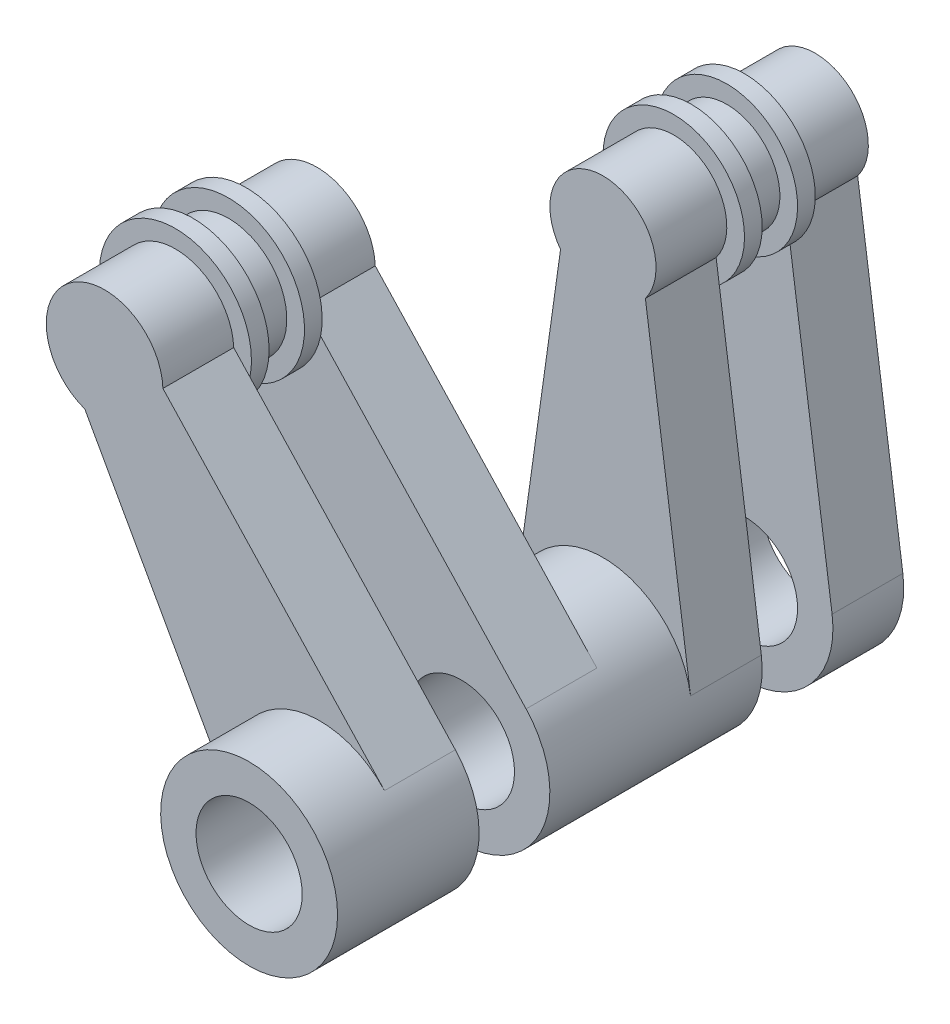
ISO-10303-21;
HEADER;
FILE_DESCRIPTION(('STEP AP214'),'2;1');
FILE_NAME('part.step','',(''),(''),'','','');
FILE_SCHEMA(('AUTOMOTIVE_DESIGN { 1 0 10303 214 1 1 1 1 }'));
ENDSEC;
DATA;
#1=APPLICATION_CONTEXT('core data for automotive mechanical design processes');
#2=APPLICATION_PROTOCOL_DEFINITION('international standard','automotive_design',2000,#1);
#3=PRODUCT_CONTEXT('',#1,'mechanical');
#4=PRODUCT('Part','Part','',(#3));
#5=PRODUCT_RELATED_PRODUCT_CATEGORY('part','',(#4));
#6=PRODUCT_DEFINITION_FORMATION('','',#4);
#7=PRODUCT_DEFINITION_CONTEXT('part definition',#1,'design');
#8=PRODUCT_DEFINITION('design','',#6,#7);
#9=PRODUCT_DEFINITION_SHAPE('','',#8);
#10=(LENGTH_UNIT() NAMED_UNIT(*) SI_UNIT(.MILLI.,.METRE.));
#11=(NAMED_UNIT(*) PLANE_ANGLE_UNIT() SI_UNIT($,.RADIAN.));
#12=(NAMED_UNIT(*) SI_UNIT($,.STERADIAN.) SOLID_ANGLE_UNIT());
#13=UNCERTAINTY_MEASURE_WITH_UNIT(LENGTH_MEASURE(1.E-05),#10,'distance_accuracy_value','');
#14=(GEOMETRIC_REPRESENTATION_CONTEXT(3) GLOBAL_UNCERTAINTY_ASSIGNED_CONTEXT((#13)) GLOBAL_UNIT_ASSIGNED_CONTEXT((#10,
#11,#12)) REPRESENTATION_CONTEXT('',''));
#15=CARTESIAN_POINT('',(0.,0.,0.));
#16=DIRECTION('',(0.,0.,1.));
#17=DIRECTION('',(1.,0.,0.));
#18=AXIS2_PLACEMENT_3D('',#15,#16,#17);
#19=CARTESIAN_POINT('',(0.,10.34,2.));
#20=DIRECTION('',(0.,0.,-1.));
#21=DIRECTION('',(-1.,0.,0.));
#22=AXIS2_PLACEMENT_3D('',#19,#20,#21);
#23=CYLINDRICAL_SURFACE('',#22,1.5);
#24=DIRECTION('',(0.,0.,1.));
#25=VECTOR('',#24,1.);
#26=CARTESIAN_POINT('',(1.19886698866081,9.4384912959381,4.));
#27=LINE('',#26,#25);
#28=CARTESIAN_POINT('',(1.19886698866081,9.4384912959381,4.));
#29=VERTEX_POINT('',#28);
#30=CARTESIAN_POINT('',(1.19886698866081,9.4384912959381,6.));
#31=VERTEX_POINT('',#30);
#32=EDGE_CURVE('E230',#29,#31,#27,.T.);
#33=ORIENTED_EDGE('',*,*,#32,.F.);
#34=CARTESIAN_POINT('',(0.,10.34,4.));
#35=DIRECTION('',(0.,0.,1.));
#36=DIRECTION('',(1.,0.,0.));
#37=AXIS2_PLACEMENT_3D('',#34,#35,#36);
#38=CIRCLE('',#37,1.5);
#39=CARTESIAN_POINT('',(-1.19877786302463,9.43837278483726,4.));
#40=VERTEX_POINT('',#39);
#41=EDGE_CURVE('E204',#29,#40,#38,.T.);
#42=ORIENTED_EDGE('',*,*,#41,.T.);
#43=DIRECTION('',(0.,0.,1.));
#44=VECTOR('',#43,1.);
#45=CARTESIAN_POINT('',(-1.19877786302463,9.43837278483726,4.));
#46=LINE('',#45,#44);
#47=CARTESIAN_POINT('',(-1.19877786302463,9.43837278483726,6.));
#48=VERTEX_POINT('',#47);
#49=EDGE_CURVE('E219',#40,#48,#46,.T.);
#50=ORIENTED_EDGE('',*,*,#49,.T.);
#51=CARTESIAN_POINT('',(0.,10.34,6.));
#52=DIRECTION('',(0.,0.,1.));
#53=DIRECTION('',(1.,0.,0.));
#54=AXIS2_PLACEMENT_3D('',#51,#52,#53);
#55=CIRCLE('',#54,1.5);
#56=EDGE_CURVE('E231',#31,#48,#55,.T.);
#57=ORIENTED_EDGE('',*,*,#56,.F.);
#58=EDGE_LOOP('',(#33,#42,#50,#57));
#59=FACE_BOUND('',#58,.T.);
#60=ADVANCED_FACE('F45',(#59),#23,.T.);
#61=CARTESIAN_POINT('',(-6.08359041985846,8.36095255359139,10.));
#62=DIRECTION('',(0.,0.,-1.));
#63=DIRECTION('',(-1.,0.,0.));
#64=AXIS2_PLACEMENT_3D('',#61,#62,#63);
#65=CYLINDRICAL_SURFACE('',#64,1.64862154811596);
#66=CARTESIAN_POINT('',(-6.08359041985846,8.36095255359139,11.5));
#67=DIRECTION('',(0.,0.,1.));
#68=DIRECTION('',(1.,0.,0.));
#69=AXIS2_PLACEMENT_3D('',#66,#67,#68);
#70=CIRCLE('',#69,1.64862154811596);
#71=CARTESIAN_POINT('',(-4.4349688717425,8.36095255359139,11.5));
#72=VERTEX_POINT('',#71);
#73=EDGE_CURVE('E301',#72,#72,#70,.T.);
#74=ORIENTED_EDGE('',*,*,#73,.F.);
#75=EDGE_LOOP('',(#74));
#76=FACE_BOUND('',#75,.T.);
#77=CARTESIAN_POINT('',(-6.08359041985846,8.36095255359139,10.5));
#78=DIRECTION('',(0.,0.,-1.));
#79=DIRECTION('',(-1.,0.,0.));
#80=AXIS2_PLACEMENT_3D('',#77,#78,#79);
#81=CIRCLE('',#80,1.64862154811596);
#82=CARTESIAN_POINT('',(-7.73221196797443,8.36095255359139,10.5));
#83=VERTEX_POINT('',#82);
#84=EDGE_CURVE('E311',#83,#83,#81,.T.);
#85=ORIENTED_EDGE('',*,*,#84,.F.);
#86=EDGE_LOOP('',(#85));
#87=FACE_BOUND('',#86,.T.);
#88=ADVANCED_FACE('F512',(#76,#87),#65,.T.);
#89=CARTESIAN_POINT('',(-6.08359041985846,8.36095255359139,12.));
#90=DIRECTION('',(0.,0.,1.));
#91=DIRECTION('',(1.,0.,0.));
#92=AXIS2_PLACEMENT_3D('',#89,#90,#91);
#93=PLANE('',#92);
#94=DIRECTION('',(0.485671715826206,-0.874141284030464,0.));
#95=VECTOR('',#94,1.);
#96=CARTESIAN_POINT('',(-6.64381956136073,6.81043769783415,12.));
#97=LINE('',#96,#95);
#98=CARTESIAN_POINT('',(-6.64381956136073,6.81043769783415,12.));
#99=VERTEX_POINT('',#98);
#100=CARTESIAN_POINT('',(-6.31867935565751,6.22523072027762,12.));
#101=VERTEX_POINT('',#100);
#102=EDGE_CURVE('E392',#99,#101,#97,.T.);
#103=ORIENTED_EDGE('',*,*,#102,.F.);
#104=CARTESIAN_POINT('',(-6.08359041985846,8.36095255359139,12.));
#105=DIRECTION('',(0.,0.,1.));
#106=DIRECTION('',(1.,0.,0.));
#107=AXIS2_PLACEMENT_3D('',#104,#105,#106);
#108=CIRCLE('',#107,1.64862154811596);
#109=CARTESIAN_POINT('',(-4.43592008775849,8.41694796081221,12.));
#110=VERTEX_POINT('',#109);
#111=EDGE_CURVE('E307',#110,#99,#108,.T.);
#112=ORIENTED_EDGE('',*,*,#111,.F.);
#113=DIRECTION('',(-0.682307542748021,0.731065261867337,0.));
#114=VECTOR('',#113,1.);
#115=CARTESIAN_POINT('',(-4.43592008775849,8.41694796081221,12.));
#116=LINE('',#115,#114);
#117=CARTESIAN_POINT('',(-3.97913908204446,7.92752536962494,12.));
#118=VERTEX_POINT('',#117);
#119=EDGE_CURVE('E401',#118,#110,#116,.T.);
#120=ORIENTED_EDGE('',*,*,#119,.F.);
#121=CARTESIAN_POINT('',(-6.08359041985846,8.36095255359139,12.));
#122=DIRECTION('',(0.,0.,1.));
#123=DIRECTION('',(1.,0.,0.));
#124=AXIS2_PLACEMENT_3D('',#121,#122,#123);
#125=CIRCLE('',#124,2.14862154811596);
#126=EDGE_CURVE('E376',#118,#101,#125,.T.);
#127=ORIENTED_EDGE('',*,*,#126,.T.);
#128=EDGE_LOOP('',(#103,#112,#120,#127));
#129=FACE_BOUND('',#128,.T.);
#130=ADVANCED_FACE('F519',(#129),#93,.T.);
#131=CARTESIAN_POINT('',(-6.08359041985846,8.36095255359139,11.5));
#132=DIRECTION('',(0.,0.,1.));
#133=DIRECTION('',(1.,0.,0.));
#134=AXIS2_PLACEMENT_3D('',#131,#132,#133);
#135=CYLINDRICAL_SURFACE('',#134,2.14862154811596);
#136=CARTESIAN_POINT('',(-6.08359041985846,8.36095255359139,11.5));
#137=DIRECTION('',(0.,0.,1.));
#138=DIRECTION('',(1.,0.,0.));
#139=AXIS2_PLACEMENT_3D('',#136,#137,#138);
#140=CIRCLE('',#139,2.14862154811596);
#141=CARTESIAN_POINT('',(-3.9349688717425,8.36095255359139,11.5));
#142=VERTEX_POINT('',#141);
#143=EDGE_CURVE('E377',#142,#142,#140,.T.);
#144=ORIENTED_EDGE('',*,*,#143,.T.);
#145=EDGE_LOOP('',(#144));
#146=FACE_BOUND('',#145,.T.);
#147=EDGE_CURVE('E381',#101,#118,#125,.T.);
#148=ORIENTED_EDGE('',*,*,#147,.F.);
#149=ORIENTED_EDGE('',*,*,#126,.F.);
#150=EDGE_LOOP('',(#148,#149));
#151=FACE_BOUND('',#150,.T.);
#152=ADVANCED_FACE('F562',(#146,#151),#135,.T.);
#153=CARTESIAN_POINT('',(-6.08359041985846,8.36095255359139,11.5));
#154=DIRECTION('',(0.,0.,1.));
#155=DIRECTION('',(1.,0.,0.));
#156=AXIS2_PLACEMENT_3D('',#153,#154,#155);
#157=PLANE('',#156);
#158=ORIENTED_EDGE('',*,*,#73,.T.);
#159=EDGE_LOOP('',(#158));
#160=FACE_BOUND('',#159,.T.);
#161=ORIENTED_EDGE('',*,*,#143,.F.);
#162=EDGE_LOOP('',(#161));
#163=FACE_BOUND('',#162,.T.);
#164=ADVANCED_FACE('F558',(#160,#163),#157,.F.);
#165=CARTESIAN_POINT('',(0.,10.34,16.));
#166=DIRECTION('',(0.,0.,1.));
#167=DIRECTION('',(1.,0.,0.));
#168=AXIS2_PLACEMENT_3D('',#165,#166,#167);
#169=PLANE('',#168);
#170=CARTESIAN_POINT('',(0.,0.,16.));
#171=DIRECTION('',(0.,0.,1.));
#172=DIRECTION('',(1.,0.,0.));
#173=AXIS2_PLACEMENT_3D('',#170,#171,#172);
#174=CIRCLE('',#173,1.5);
#175=CARTESIAN_POINT('',(1.5,0.,16.));
#176=VERTEX_POINT('',#175);
#177=EDGE_CURVE('E302',#176,#176,#174,.T.);
#178=ORIENTED_EDGE('',*,*,#177,.F.);
#179=EDGE_LOOP('',(#178));
#180=FACE_BOUND('',#179,.T.);
#181=CARTESIAN_POINT('',(0.,0.,16.));
#182=DIRECTION('',(0.,0.,1.));
#183=DIRECTION('',(1.,0.,0.));
#184=AXIS2_PLACEMENT_3D('',#181,#182,#183);
#185=CIRCLE('',#184,2.5);
#186=CARTESIAN_POINT('',(2.5,0.,16.));
#187=VERTEX_POINT('',#186);
#188=EDGE_CURVE('E430',#187,#187,#185,.T.);
#189=ORIENTED_EDGE('',*,*,#188,.T.);
#190=EDGE_LOOP('',(#189));
#191=FACE_BOUND('',#190,.T.);
#192=ADVANCED_FACE('F561',(#180,#191),#169,.T.);
#193=CARTESIAN_POINT('',(0.,0.,18.));
#194=DIRECTION('',(0.,0.,-1.));
#195=DIRECTION('',(-1.,0.,0.));
#196=AXIS2_PLACEMENT_3D('',#193,#194,#195);
#197=CYLINDRICAL_SURFACE('',#196,1.5);
#198=CARTESIAN_POINT('',(0.,0.,12.));
#199=DIRECTION('',(0.,0.,1.));
#200=DIRECTION('',(1.,0.,0.));
#201=AXIS2_PLACEMENT_3D('',#198,#199,#200);
#202=CIRCLE('',#201,1.5);
#203=CARTESIAN_POINT('',(1.5,0.,12.));
#204=VERTEX_POINT('',#203);
#205=EDGE_CURVE('E306',#204,#204,#202,.T.);
#206=ORIENTED_EDGE('',*,*,#205,.F.);
#207=EDGE_LOOP('',(#206));
#208=FACE_BOUND('',#207,.T.);
#209=ORIENTED_EDGE('',*,*,#177,.T.);
#210=EDGE_LOOP('',(#209));
#211=FACE_BOUND('',#210,.T.);
#212=ADVANCED_FACE('F572',(#208,#211),#197,.F.);
#213=CARTESIAN_POINT('',(0.,0.,18.));
#214=DIRECTION('',(0.,0.,-1.));
#215=DIRECTION('',(-1.,0.,0.));
#216=AXIS2_PLACEMENT_3D('',#213,#214,#215);
#217=CYLINDRICAL_SURFACE('',#216,2.5);
#218=CARTESIAN_POINT('',(0.,0.,14.));
#219=DIRECTION('',(0.,0.,1.));
#220=DIRECTION('',(1.,0.,0.));
#221=AXIS2_PLACEMENT_3D('',#218,#219,#220);
#222=CIRCLE('',#221,2.5);
#223=CARTESIAN_POINT('',(1.82766315466834,1.70576885687005,14.));
#224=VERTEX_POINT('',#223);
#225=CARTESIAN_POINT('',(-2.18535321007616,-1.21417928956552,14.));
#226=VERTEX_POINT('',#225);
#227=EDGE_CURVE('E431',#224,#226,#222,.T.);
#228=ORIENTED_EDGE('',*,*,#227,.T.);
#229=DIRECTION('',(0.,0.,1.));
#230=VECTOR('',#229,1.);
#231=CARTESIAN_POINT('',(-2.18535321007616,-1.21417928956552,12.));
#232=LINE('',#231,#230);
#233=CARTESIAN_POINT('',(-2.18535321007616,-1.21417928956552,12.));
#234=VERTEX_POINT('',#233);
#235=EDGE_CURVE('E423',#234,#226,#232,.T.);
#236=ORIENTED_EDGE('',*,*,#235,.F.);
#237=CARTESIAN_POINT('',(0.,0.,12.));
#238=DIRECTION('',(0.,0.,1.));
#239=DIRECTION('',(1.,0.,0.));
#240=AXIS2_PLACEMENT_3D('',#237,#238,#239);
#241=CIRCLE('',#240,2.5);
#242=CARTESIAN_POINT('',(1.82766315466834,1.70576885687005,12.));
#243=VERTEX_POINT('',#242);
#244=EDGE_CURVE('E396',#234,#243,#241,.T.);
#245=ORIENTED_EDGE('',*,*,#244,.T.);
#246=DIRECTION('',(0.,0.,1.));
#247=VECTOR('',#246,1.);
#248=CARTESIAN_POINT('',(1.82766315466834,1.70576885687005,12.));
#249=LINE('',#248,#247);
#250=EDGE_CURVE('E419',#243,#224,#249,.T.);
#251=ORIENTED_EDGE('',*,*,#250,.T.);
#252=EDGE_LOOP('',(#228,#236,#245,#251));
#253=FACE_BOUND('',#252,.T.);
#254=ORIENTED_EDGE('',*,*,#188,.F.);
#255=EDGE_LOOP('',(#254));
#256=FACE_BOUND('',#255,.T.);
#257=ADVANCED_FACE('F583',(#253,#256),#217,.T.);
#258=CARTESIAN_POINT('',(-6.08359041985846,8.36095255359139,14.));
#259=DIRECTION('',(0.,0.,-1.));
#260=DIRECTION('',(1.,0.,0.));
#261=AXIS2_PLACEMENT_3D('',#258,#259,#260);
#262=PLANE('',#261);
#263=DIRECTION('',(-0.682307542748021,0.731065261867337,0.));
#264=VECTOR('',#263,1.);
#265=CARTESIAN_POINT('',(-4.43592008775849,8.41694796081221,14.));
#266=LINE('',#265,#264);
#267=CARTESIAN_POINT('',(-4.43592008775849,8.41694796081221,14.));
#268=VERTEX_POINT('',#267);
#269=EDGE_CURVE('E413',#224,#268,#266,.T.);
#270=ORIENTED_EDGE('',*,*,#269,.T.);
#271=CARTESIAN_POINT('',(-6.08359041985846,8.36095255359139,14.));
#272=DIRECTION('',(0.,0.,1.));
#273=DIRECTION('',(1.,0.,0.));
#274=AXIS2_PLACEMENT_3D('',#271,#272,#273);
#275=CIRCLE('',#274,1.64862154811596);
#276=CARTESIAN_POINT('',(-6.64381956136073,6.81043769783415,14.));
#277=VERTEX_POINT('',#276);
#278=EDGE_CURVE('E391',#268,#277,#275,.T.);
#279=ORIENTED_EDGE('',*,*,#278,.T.);
#280=DIRECTION('',(0.485671715826206,-0.874141284030464,0.));
#281=VECTOR('',#280,1.);
#282=CARTESIAN_POINT('',(-6.64381956136073,6.81043769783415,14.));
#283=LINE('',#282,#281);
#284=EDGE_CURVE('E410',#277,#226,#283,.T.);
#285=ORIENTED_EDGE('',*,*,#284,.T.);
#286=ORIENTED_EDGE('',*,*,#227,.F.);
#287=EDGE_LOOP('',(#270,#279,#285,#286));
#288=FACE_BOUND('',#287,.T.);
#289=ADVANCED_FACE('F579',(#288),#262,.F.);
#290=CARTESIAN_POINT('',(-6.64381956136073,6.81043769783415,12.));
#291=DIRECTION('',(0.874141284030464,0.485671715826206,0.));
#292=DIRECTION('',(-0.485671715826206,0.874141284030464,0.));
#293=AXIS2_PLACEMENT_3D('',#290,#291,#292);
#294=PLANE('',#293);
#295=ORIENTED_EDGE('',*,*,#284,.F.);
#296=DIRECTION('',(0.,0.,1.));
#297=VECTOR('',#296,1.);
#298=CARTESIAN_POINT('',(-6.64381956136073,6.81043769783415,12.));
#299=LINE('',#298,#297);
#300=EDGE_CURVE('E427',#99,#277,#299,.T.);
#301=ORIENTED_EDGE('',*,*,#300,.F.);
#302=ORIENTED_EDGE('',*,*,#102,.T.);
#303=EDGE_CURVE('E397',#101,#234,#97,.T.);
#304=ORIENTED_EDGE('',*,*,#303,.T.);
#305=ORIENTED_EDGE('',*,*,#235,.T.);
#306=EDGE_LOOP('',(#295,#301,#302,#304,#305));
#307=FACE_BOUND('',#306,.T.);
#308=ADVANCED_FACE('F582',(#307),#294,.F.);
#309=CARTESIAN_POINT('',(-4.43592008775849,8.41694796081221,12.));
#310=DIRECTION('',(-0.731065261867337,-0.682307542748021,0.));
#311=DIRECTION('',(0.682307542748021,-0.731065261867337,0.));
#312=AXIS2_PLACEMENT_3D('',#309,#310,#311);
#313=PLANE('',#312);
#314=ORIENTED_EDGE('',*,*,#269,.F.);
#315=ORIENTED_EDGE('',*,*,#250,.F.);
#316=EDGE_CURVE('E402',#243,#118,#116,.T.);
#317=ORIENTED_EDGE('',*,*,#316,.T.);
#318=ORIENTED_EDGE('',*,*,#119,.T.);
#319=DIRECTION('',(0.,0.,1.));
#320=VECTOR('',#319,1.);
#321=CARTESIAN_POINT('',(-4.43592008775849,8.41694796081221,12.));
#322=LINE('',#321,#320);
#323=EDGE_CURVE('E406',#110,#268,#322,.T.);
#324=ORIENTED_EDGE('',*,*,#323,.T.);
#325=EDGE_LOOP('',(#314,#315,#317,#318,#324));
#326=FACE_BOUND('',#325,.T.);
#327=ADVANCED_FACE('F577',(#326),#313,.F.);
#328=CARTESIAN_POINT('',(-6.08359041985846,8.36095255359139,12.));
#329=DIRECTION('',(0.,0.,-1.));
#330=DIRECTION('',(1.,0.,0.));
#331=AXIS2_PLACEMENT_3D('',#328,#329,#330);
#332=PLANE('',#331);
#333=ORIENTED_EDGE('',*,*,#147,.T.);
#334=ORIENTED_EDGE('',*,*,#316,.F.);
#335=ORIENTED_EDGE('',*,*,#244,.F.);
#336=ORIENTED_EDGE('',*,*,#303,.F.);
#337=EDGE_LOOP('',(#333,#334,#335,#336));
#338=FACE_BOUND('',#337,.T.);
#339=ORIENTED_EDGE('',*,*,#205,.T.);
#340=EDGE_LOOP('',(#339));
#341=FACE_BOUND('',#340,.T.);
#342=ADVANCED_FACE('F574',(#338,#341),#332,.T.);
#343=ORIENTED_EDGE('',*,*,#323,.F.);
#344=ORIENTED_EDGE('',*,*,#111,.T.);
#345=ORIENTED_EDGE('',*,*,#300,.T.);
#346=ORIENTED_EDGE('',*,*,#278,.F.);
#347=EDGE_LOOP('',(#343,#344,#345,#346));
#348=FACE_BOUND('',#347,.T.);
#349=ADVANCED_FACE('F523',(#348),#65,.T.);
#350=CARTESIAN_POINT('',(-6.08359041985846,8.36095255359139,10.));
#351=DIRECTION('',(0.,0.,-1.));
#352=DIRECTION('',(-1.,0.,0.));
#353=AXIS2_PLACEMENT_3D('',#350,#351,#352);
#354=PLANE('',#353);
#355=DIRECTION('',(0.485671715826206,-0.874141284030464,0.));
#356=VECTOR('',#355,1.);
#357=CARTESIAN_POINT('',(-6.64381956136073,6.81043769783415,10.));
#358=LINE('',#357,#356);
#359=CARTESIAN_POINT('',(-6.64381956136073,6.81043769783415,10.));
#360=VERTEX_POINT('',#359);
#361=CARTESIAN_POINT('',(-6.31867935565751,6.22523072027762,10.));
#362=VERTEX_POINT('',#361);
#363=EDGE_CURVE('E443',#360,#362,#358,.T.);
#364=ORIENTED_EDGE('',*,*,#363,.T.);
#365=CARTESIAN_POINT('',(-6.08359041985846,8.36095255359139,10.));
#366=DIRECTION('',(0.,0.,-1.));
#367=DIRECTION('',(-1.,0.,0.));
#368=AXIS2_PLACEMENT_3D('',#365,#366,#367);
#369=CIRCLE('',#368,2.14862154811596);
#370=CARTESIAN_POINT('',(-3.97913908204446,7.92752536962494,10.));
#371=VERTEX_POINT('',#370);
#372=EDGE_CURVE('E369',#362,#371,#369,.T.);
#373=ORIENTED_EDGE('',*,*,#372,.T.);
#374=DIRECTION('',(-0.682307542748021,0.731065261867337,0.));
#375=VECTOR('',#374,1.);
#376=CARTESIAN_POINT('',(-4.43592008775849,8.41694796081221,10.));
#377=LINE('',#376,#375);
#378=CARTESIAN_POINT('',(-4.43592008775849,8.41694796081221,10.));
#379=VERTEX_POINT('',#378);
#380=EDGE_CURVE('E69',#371,#379,#377,.T.);
#381=ORIENTED_EDGE('',*,*,#380,.T.);
#382=CARTESIAN_POINT('',(-6.08359041985846,8.36095255359139,10.));
#383=DIRECTION('',(0.,0.,-1.));
#384=DIRECTION('',(-1.,0.,0.));
#385=AXIS2_PLACEMENT_3D('',#382,#383,#384);
#386=CIRCLE('',#385,1.64862154811596);
#387=EDGE_CURVE('E368',#360,#379,#386,.T.);
#388=ORIENTED_EDGE('',*,*,#387,.F.);
#389=EDGE_LOOP('',(#364,#373,#381,#388));
#390=FACE_BOUND('',#389,.T.);
#391=ADVANCED_FACE('F546',(#390),#354,.T.);
#392=CARTESIAN_POINT('',(-6.08359041985846,8.36095255359139,10.));
#393=DIRECTION('',(0.,0.,1.));
#394=DIRECTION('',(1.,0.,0.));
#395=AXIS2_PLACEMENT_3D('',#392,#393,#394);
#396=CYLINDRICAL_SURFACE('',#395,2.14862154811596);
#397=EDGE_CURVE('E61',#371,#362,#369,.T.);
#398=ORIENTED_EDGE('',*,*,#397,.F.);
#399=ORIENTED_EDGE('',*,*,#372,.F.);
#400=EDGE_LOOP('',(#398,#399));
#401=FACE_BOUND('',#400,.T.);
#402=CARTESIAN_POINT('',(-6.08359041985846,8.36095255359139,10.5));
#403=DIRECTION('',(0.,0.,-1.));
#404=DIRECTION('',(-1.,0.,0.));
#405=AXIS2_PLACEMENT_3D('',#402,#403,#404);
#406=CIRCLE('',#405,2.14862154811596);
#407=CARTESIAN_POINT('',(-8.23221196797443,8.36095255359139,10.5));
#408=VERTEX_POINT('',#407);
#409=EDGE_CURVE('E358',#408,#408,#406,.T.);
#410=ORIENTED_EDGE('',*,*,#409,.T.);
#411=EDGE_LOOP('',(#410));
#412=FACE_BOUND('',#411,.T.);
#413=ADVANCED_FACE('F549',(#401,#412),#396,.T.);
#414=CARTESIAN_POINT('',(-6.08359041985846,8.36095255359139,10.5));
#415=DIRECTION('',(0.,0.,-1.));
#416=DIRECTION('',(-1.,0.,0.));
#417=AXIS2_PLACEMENT_3D('',#414,#415,#416);
#418=PLANE('',#417);
#419=ORIENTED_EDGE('',*,*,#84,.T.);
#420=EDGE_LOOP('',(#419));
#421=FACE_BOUND('',#420,.T.);
#422=ORIENTED_EDGE('',*,*,#409,.F.);
#423=EDGE_LOOP('',(#422));
#424=FACE_BOUND('',#423,.T.);
#425=ADVANCED_FACE('F551',(#421,#424),#418,.F.);
#426=CARTESIAN_POINT('',(0.,10.34,4.));
#427=DIRECTION('',(0.,0.,-1.));
#428=DIRECTION('',(1.,0.,0.));
#429=AXIS2_PLACEMENT_3D('',#426,#427,#428);
#430=PLANE('',#429);
#431=DIRECTION('',(-0.139099848307407,-0.990278360967691,0.));
#432=VECTOR('',#431,1.);
#433=CARTESIAN_POINT('',(-1.19877786302463,9.43837278483726,4.));
#434=LINE('',#433,#432);
#435=CARTESIAN_POINT('',(-1.28715009898771,8.80923397520198,4.));
#436=VERTEX_POINT('',#435);
#437=CARTESIAN_POINT('',(-2.47569590241923,0.347749620768517,4.));
#438=VERTEX_POINT('',#437);
#439=EDGE_CURVE('E206',#436,#438,#434,.T.);
#440=ORIENTED_EDGE('',*,*,#439,.F.);
#441=CARTESIAN_POINT('',(0.,10.34,4.));
#442=DIRECTION('',(0.,0.,1.));
#443=DIRECTION('',(1.,0.,0.));
#444=AXIS2_PLACEMENT_3D('',#441,#442,#443);
#445=CIRCLE('',#444,2.);
#446=CARTESIAN_POINT('',(1.28723815027087,8.80930801776215,4.));
#447=VERTEX_POINT('',#446);
#448=EDGE_CURVE('E194',#436,#447,#445,.T.);
#449=ORIENTED_EDGE('',*,*,#448,.T.);
#450=DIRECTION('',(-0.139088549176105,0.990279948038981,0.));
#451=VECTOR('',#450,1.);
#452=CARTESIAN_POINT('',(1.19886698866081,9.4384912959381,4.));
#453=LINE('',#452,#451);
#454=CARTESIAN_POINT('',(2.47569987009745,0.347721372940258,4.));
#455=VERTEX_POINT('',#454);
#456=EDGE_CURVE('E227',#455,#447,#453,.T.);
#457=ORIENTED_EDGE('',*,*,#456,.F.);
#458=CARTESIAN_POINT('',(0.,0.,4.));
#459=DIRECTION('',(0.,0.,1.));
#460=DIRECTION('',(1.,0.,0.));
#461=AXIS2_PLACEMENT_3D('',#458,#459,#460);
#462=CIRCLE('',#461,2.5);
#463=EDGE_CURVE('E210',#438,#455,#462,.T.);
#464=ORIENTED_EDGE('',*,*,#463,.F.);
#465=EDGE_LOOP('',(#440,#449,#457,#464));
#466=FACE_BOUND('',#465,.T.);
#467=CARTESIAN_POINT('',(0.,0.,4.));
#468=DIRECTION('',(0.,0.,1.));
#469=DIRECTION('',(1.,0.,0.));
#470=AXIS2_PLACEMENT_3D('',#467,#468,#469);
#471=CIRCLE('',#470,1.5);
#472=CARTESIAN_POINT('',(1.5,0.,4.));
#473=VERTEX_POINT('',#472);
#474=EDGE_CURVE('E224',#473,#473,#471,.T.);
#475=ORIENTED_EDGE('',*,*,#474,.T.);
#476=EDGE_LOOP('',(#475));
#477=FACE_BOUND('',#476,.T.);
#478=ADVANCED_FACE('F207',(#466,#477),#430,.T.);
#479=CARTESIAN_POINT('',(-1.19877786302463,9.43837278483726,4.));
#480=DIRECTION('',(0.990278360967691,-0.139099848307407,0.));
#481=DIRECTION('',(0.139099848307407,0.990278360967691,0.));
#482=AXIS2_PLACEMENT_3D('',#479,#480,#481);
#483=PLANE('',#482);
#484=DIRECTION('',(-0.139099848307407,-0.990278360967691,0.));
#485=VECTOR('',#484,1.);
#486=CARTESIAN_POINT('',(-1.19877786302463,9.43837278483726,6.));
#487=LINE('',#486,#485);
#488=CARTESIAN_POINT('',(-2.47569590241923,0.347749620768517,6.));
#489=VERTEX_POINT('',#488);
#490=EDGE_CURVE('E235',#48,#489,#487,.T.);
#491=ORIENTED_EDGE('',*,*,#490,.F.);
#492=ORIENTED_EDGE('',*,*,#49,.F.);
#493=EDGE_CURVE('E187',#40,#436,#434,.T.);
#494=ORIENTED_EDGE('',*,*,#493,.T.);
#495=ORIENTED_EDGE('',*,*,#439,.T.);
#496=DIRECTION('',(0.,0.,1.));
#497=VECTOR('',#496,1.);
#498=CARTESIAN_POINT('',(-2.47569590241923,0.347749620768517,4.));
#499=LINE('',#498,#497);
#500=EDGE_CURVE('E248',#438,#489,#499,.T.);
#501=ORIENTED_EDGE('',*,*,#500,.T.);
#502=EDGE_LOOP('',(#491,#492,#494,#495,#501));
#503=FACE_BOUND('',#502,.T.);
#504=ADVANCED_FACE('F218',(#503),#483,.F.);
#505=CARTESIAN_POINT('',(0.,10.34,6.));
#506=DIRECTION('',(0.,0.,-1.));
#507=DIRECTION('',(1.,0.,0.));
#508=AXIS2_PLACEMENT_3D('',#505,#506,#507);
#509=PLANE('',#508);
#510=CARTESIAN_POINT('',(0.,0.,6.));
#511=DIRECTION('',(0.,0.,1.));
#512=DIRECTION('',(1.,0.,0.));
#513=AXIS2_PLACEMENT_3D('',#510,#511,#512);
#514=CIRCLE('',#513,2.5);
#515=CARTESIAN_POINT('',(2.47569987009745,0.347721372940258,6.));
#516=VERTEX_POINT('',#515);
#517=EDGE_CURVE('E480',#516,#489,#514,.T.);
#518=ORIENTED_EDGE('',*,*,#517,.F.);
#519=DIRECTION('',(-0.139088549176105,0.990279948038981,0.));
#520=VECTOR('',#519,1.);
#521=CARTESIAN_POINT('',(1.19886698866081,9.4384912959381,6.));
#522=LINE('',#521,#520);
#523=EDGE_CURVE('E214',#516,#31,#522,.T.);
#524=ORIENTED_EDGE('',*,*,#523,.T.);
#525=ORIENTED_EDGE('',*,*,#56,.T.);
#526=ORIENTED_EDGE('',*,*,#490,.T.);
#527=EDGE_LOOP('',(#518,#524,#525,#526));
#528=FACE_BOUND('',#527,.T.);
#529=ADVANCED_FACE('F490',(#528),#509,.F.);
#530=CARTESIAN_POINT('',(1.19886698866081,9.4384912959381,4.));
#531=DIRECTION('',(-0.990279948038981,-0.139088549176105,0.));
#532=DIRECTION('',(0.139088549176105,-0.990279948038981,0.));
#533=AXIS2_PLACEMENT_3D('',#530,#531,#532);
#534=PLANE('',#533);
#535=ORIENTED_EDGE('',*,*,#523,.F.);
#536=DIRECTION('',(0.,0.,1.));
#537=VECTOR('',#536,1.);
#538=CARTESIAN_POINT('',(2.47569987009745,0.347721372940258,4.));
#539=LINE('',#538,#537);
#540=EDGE_CURVE('E244',#455,#516,#539,.T.);
#541=ORIENTED_EDGE('',*,*,#540,.F.);
#542=ORIENTED_EDGE('',*,*,#456,.T.);
#543=EDGE_CURVE('E190',#447,#29,#453,.T.);
#544=ORIENTED_EDGE('',*,*,#543,.T.);
#545=ORIENTED_EDGE('',*,*,#32,.T.);
#546=EDGE_LOOP('',(#535,#541,#542,#544,#545));
#547=FACE_BOUND('',#546,.T.);
#548=ADVANCED_FACE('F616',(#547),#534,.F.);
#549=CARTESIAN_POINT('',(0.,0.,4.));
#550=DIRECTION('',(0.,0.,1.));
#551=DIRECTION('',(-1.,0.,0.));
#552=AXIS2_PLACEMENT_3D('',#549,#550,#551);
#553=CYLINDRICAL_SURFACE('',#552,1.5);
#554=ORIENTED_EDGE('',*,*,#474,.F.);
#555=EDGE_LOOP('',(#554));
#556=FACE_BOUND('',#555,.T.);
#557=CARTESIAN_POINT('',(0.,0.,10.));
#558=DIRECTION('',(0.,0.,1.));
#559=DIRECTION('',(1.,0.,0.));
#560=AXIS2_PLACEMENT_3D('',#557,#558,#559);
#561=CIRCLE('',#560,1.5);
#562=CARTESIAN_POINT('',(1.5,0.,10.));
#563=VERTEX_POINT('',#562);
#564=EDGE_CURVE('E435',#563,#563,#561,.T.);
#565=ORIENTED_EDGE('',*,*,#564,.T.);
#566=EDGE_LOOP('',(#565));
#567=FACE_BOUND('',#566,.T.);
#568=ADVANCED_FACE('F613',(#556,#567),#553,.F.);
#569=CARTESIAN_POINT('',(0.,0.,4.));
#570=DIRECTION('',(0.,0.,1.));
#571=DIRECTION('',(-1.,0.,0.));
#572=AXIS2_PLACEMENT_3D('',#569,#570,#571);
#573=CYLINDRICAL_SURFACE('',#572,2.5);
#574=ORIENTED_EDGE('',*,*,#540,.T.);
#575=ORIENTED_EDGE('',*,*,#517,.T.);
#576=ORIENTED_EDGE('',*,*,#500,.F.);
#577=ORIENTED_EDGE('',*,*,#463,.T.);
#578=EDGE_LOOP('',(#574,#575,#576,#577));
#579=FACE_BOUND('',#578,.T.);
#580=CARTESIAN_POINT('',(0.,0.,8.));
#581=DIRECTION('',(0.,0.,1.));
#582=DIRECTION('',(1.,0.,0.));
#583=AXIS2_PLACEMENT_3D('',#580,#581,#582);
#584=CIRCLE('',#583,2.5);
#585=CARTESIAN_POINT('',(1.82766315466834,1.70576885687005,8.));
#586=VERTEX_POINT('',#585);
#587=CARTESIAN_POINT('',(-2.18535321007616,-1.21417928956552,8.));
#588=VERTEX_POINT('',#587);
#589=EDGE_CURVE('E481',#586,#588,#584,.T.);
#590=ORIENTED_EDGE('',*,*,#589,.F.);
#591=DIRECTION('',(0.,0.,-1.));
#592=VECTOR('',#591,1.);
#593=CARTESIAN_POINT('',(1.82766315466834,1.70576885687005,10.));
#594=LINE('',#593,#592);
#595=CARTESIAN_POINT('',(1.82766315466834,1.70576885687005,10.));
#596=VERTEX_POINT('',#595);
#597=EDGE_CURVE('E468',#596,#586,#594,.T.);
#598=ORIENTED_EDGE('',*,*,#597,.F.);
#599=CARTESIAN_POINT('',(0.,0.,10.));
#600=DIRECTION('',(0.,0.,1.));
#601=DIRECTION('',(1.,0.,0.));
#602=AXIS2_PLACEMENT_3D('',#599,#600,#601);
#603=CIRCLE('',#602,2.5);
#604=CARTESIAN_POINT('',(-2.18535321007616,-1.21417928956552,10.));
#605=VERTEX_POINT('',#604);
#606=EDGE_CURVE('E447',#605,#596,#603,.T.);
#607=ORIENTED_EDGE('',*,*,#606,.F.);
#608=DIRECTION('',(0.,0.,-1.));
#609=VECTOR('',#608,1.);
#610=CARTESIAN_POINT('',(-2.18535321007616,-1.21417928956552,10.));
#611=LINE('',#610,#609);
#612=EDGE_CURVE('E472',#605,#588,#611,.T.);
#613=ORIENTED_EDGE('',*,*,#612,.T.);
#614=EDGE_LOOP('',(#590,#598,#607,#613));
#615=FACE_BOUND('',#614,.T.);
#616=ADVANCED_FACE('F487',(#579,#615),#573,.T.);
#617=CARTESIAN_POINT('',(-6.08359041985846,8.36095255359139,8.));
#618=DIRECTION('',(0.,0.,1.));
#619=DIRECTION('',(1.,0.,0.));
#620=AXIS2_PLACEMENT_3D('',#617,#618,#619);
#621=PLANE('',#620);
#622=DIRECTION('',(-0.682307542748021,0.731065261867337,0.));
#623=VECTOR('',#622,1.);
#624=CARTESIAN_POINT('',(-4.43592008775849,8.41694796081221,8.));
#625=LINE('',#624,#623);
#626=CARTESIAN_POINT('',(-4.43592008775849,8.41694796081221,8.));
#627=VERTEX_POINT('',#626);
#628=EDGE_CURVE('E462',#586,#627,#625,.T.);
#629=ORIENTED_EDGE('',*,*,#628,.F.);
#630=ORIENTED_EDGE('',*,*,#589,.T.);
#631=DIRECTION('',(0.485671715826206,-0.874141284030464,0.));
#632=VECTOR('',#631,1.);
#633=CARTESIAN_POINT('',(-6.64381956136073,6.81043769783415,8.));
#634=LINE('',#633,#632);
#635=CARTESIAN_POINT('',(-6.64381956136073,6.81043769783415,8.));
#636=VERTEX_POINT('',#635);
#637=EDGE_CURVE('E458',#636,#588,#634,.T.);
#638=ORIENTED_EDGE('',*,*,#637,.F.);
#639=CARTESIAN_POINT('',(-6.08359041985846,8.36095255359139,8.));
#640=DIRECTION('',(0.,0.,1.));
#641=DIRECTION('',(1.,0.,0.));
#642=AXIS2_PLACEMENT_3D('',#639,#640,#641);
#643=CIRCLE('',#642,1.64862154811596);
#644=EDGE_CURVE('E442',#627,#636,#643,.T.);
#645=ORIENTED_EDGE('',*,*,#644,.F.);
#646=EDGE_LOOP('',(#629,#630,#638,#645));
#647=FACE_BOUND('',#646,.T.);
#648=ADVANCED_FACE('F601',(#647),#621,.F.);
#649=CARTESIAN_POINT('',(-6.64381956136073,6.81043769783415,10.));
#650=DIRECTION('',(0.874141284030464,0.485671715826206,0.));
#651=DIRECTION('',(-0.485671715826206,0.874141284030464,0.));
#652=AXIS2_PLACEMENT_3D('',#649,#650,#651);
#653=PLANE('',#652);
#654=ORIENTED_EDGE('',*,*,#637,.T.);
#655=ORIENTED_EDGE('',*,*,#612,.F.);
#656=EDGE_CURVE('E448',#362,#605,#358,.T.);
#657=ORIENTED_EDGE('',*,*,#656,.F.);
#658=ORIENTED_EDGE('',*,*,#363,.F.);
#659=DIRECTION('',(0.,0.,-1.));
#660=VECTOR('',#659,1.);
#661=CARTESIAN_POINT('',(-6.64381956136073,6.81043769783415,10.));
#662=LINE('',#661,#660);
#663=EDGE_CURVE('E476',#360,#636,#662,.T.);
#664=ORIENTED_EDGE('',*,*,#663,.T.);
#665=EDGE_LOOP('',(#654,#655,#657,#658,#664));
#666=FACE_BOUND('',#665,.T.);
#667=ADVANCED_FACE('F604',(#666),#653,.F.);
#668=CARTESIAN_POINT('',(-4.43592008775849,8.41694796081221,10.));
#669=DIRECTION('',(-0.731065261867337,-0.682307542748021,0.));
#670=DIRECTION('',(0.682307542748021,-0.731065261867337,0.));
#671=AXIS2_PLACEMENT_3D('',#668,#669,#670);
#672=PLANE('',#671);
#673=ORIENTED_EDGE('',*,*,#628,.T.);
#674=DIRECTION('',(0.,0.,-1.));
#675=VECTOR('',#674,1.);
#676=CARTESIAN_POINT('',(-4.43592008775849,8.41694796081221,10.));
#677=LINE('',#676,#675);
#678=EDGE_CURVE('E454',#379,#627,#677,.T.);
#679=ORIENTED_EDGE('',*,*,#678,.F.);
#680=ORIENTED_EDGE('',*,*,#380,.F.);
#681=EDGE_CURVE('E451',#596,#371,#377,.T.);
#682=ORIENTED_EDGE('',*,*,#681,.F.);
#683=ORIENTED_EDGE('',*,*,#597,.T.);
#684=EDGE_LOOP('',(#673,#679,#680,#682,#683));
#685=FACE_BOUND('',#684,.T.);
#686=ADVANCED_FACE('F600',(#685),#672,.F.);
#687=CARTESIAN_POINT('',(-6.08359041985846,8.36095255359139,10.));
#688=DIRECTION('',(0.,0.,1.));
#689=DIRECTION('',(1.,0.,0.));
#690=AXIS2_PLACEMENT_3D('',#687,#688,#689);
#691=PLANE('',#690);
#692=ORIENTED_EDGE('',*,*,#681,.T.);
#693=ORIENTED_EDGE('',*,*,#397,.T.);
#694=ORIENTED_EDGE('',*,*,#656,.T.);
#695=ORIENTED_EDGE('',*,*,#606,.T.);
#696=EDGE_LOOP('',(#692,#693,#694,#695));
#697=FACE_BOUND('',#696,.T.);
#698=ORIENTED_EDGE('',*,*,#564,.F.);
#699=EDGE_LOOP('',(#698));
#700=FACE_BOUND('',#699,.T.);
#701=ADVANCED_FACE('F597',(#697,#700),#691,.T.);
#702=ORIENTED_EDGE('',*,*,#663,.F.);
#703=ORIENTED_EDGE('',*,*,#387,.T.);
#704=ORIENTED_EDGE('',*,*,#678,.T.);
#705=ORIENTED_EDGE('',*,*,#644,.T.);
#706=EDGE_LOOP('',(#702,#703,#704,#705));
#707=FACE_BOUND('',#706,.T.);
#708=ADVANCED_FACE('F522',(#707),#65,.T.);
#709=CARTESIAN_POINT('',(0.,10.34,4.));
#710=DIRECTION('',(0.,0.,1.));
#711=DIRECTION('',(1.,0.,0.));
#712=AXIS2_PLACEMENT_3D('',#709,#710,#711);
#713=PLANE('',#712);
#714=ORIENTED_EDGE('',*,*,#493,.F.);
#715=ORIENTED_EDGE('',*,*,#41,.F.);
#716=ORIENTED_EDGE('',*,*,#543,.F.);
#717=EDGE_CURVE('E183',#447,#436,#445,.T.);
#718=ORIENTED_EDGE('',*,*,#717,.T.);
#719=EDGE_LOOP('',(#714,#715,#716,#718));
#720=FACE_BOUND('',#719,.T.);
#721=ADVANCED_FACE('F185',(#720),#713,.T.);
#722=CARTESIAN_POINT('',(0.,10.34,4.));
#723=DIRECTION('',(0.,0.,-1.));
#724=DIRECTION('',(-1.,0.,0.));
#725=AXIS2_PLACEMENT_3D('',#722,#723,#724);
#726=CYLINDRICAL_SURFACE('',#725,2.);
#727=ORIENTED_EDGE('',*,*,#448,.F.);
#728=ORIENTED_EDGE('',*,*,#717,.F.);
#729=EDGE_LOOP('',(#727,#728));
#730=FACE_BOUND('',#729,.T.);
#731=CARTESIAN_POINT('',(0.,10.34,3.5));
#732=DIRECTION('',(0.,0.,1.));
#733=DIRECTION('',(1.,0.,0.));
#734=AXIS2_PLACEMENT_3D('',#731,#732,#733);
#735=CIRCLE('',#734,2.);
#736=CARTESIAN_POINT('',(2.,10.34,3.5));
#737=VERTEX_POINT('',#736);
#738=EDGE_CURVE('E195',#737,#737,#735,.T.);
#739=ORIENTED_EDGE('',*,*,#738,.T.);
#740=EDGE_LOOP('',(#739));
#741=FACE_BOUND('',#740,.T.);
#742=ADVANCED_FACE('F198',(#730,#741),#726,.T.);
#743=CARTESIAN_POINT('',(0.,10.34,3.5));
#744=DIRECTION('',(0.,0.,1.));
#745=DIRECTION('',(1.,0.,0.));
#746=AXIS2_PLACEMENT_3D('',#743,#744,#745);
#747=PLANE('',#746);
#748=CARTESIAN_POINT('',(0.,10.34,3.5));
#749=DIRECTION('',(0.,0.,1.));
#750=DIRECTION('',(1.,0.,0.));
#751=AXIS2_PLACEMENT_3D('',#748,#749,#750);
#752=CIRCLE('',#751,1.5);
#753=CARTESIAN_POINT('',(1.5,10.34,3.5));
#754=VERTEX_POINT('',#753);
#755=EDGE_CURVE('E11',#754,#754,#752,.T.);
#756=ORIENTED_EDGE('',*,*,#755,.T.);
#757=EDGE_LOOP('',(#756));
#758=FACE_BOUND('',#757,.T.);
#759=ORIENTED_EDGE('',*,*,#738,.F.);
#760=EDGE_LOOP('',(#759));
#761=FACE_BOUND('',#760,.T.);
#762=ADVANCED_FACE('F499',(#758,#761),#747,.F.);
#763=CARTESIAN_POINT('',(0.,10.34,0.));
#764=DIRECTION('',(0.,0.,1.));
#765=DIRECTION('',(1.,0.,0.));
#766=AXIS2_PLACEMENT_3D('',#763,#764,#765);
#767=PLANE('',#766);
#768=CARTESIAN_POINT('',(0.,10.34,0.));
#769=DIRECTION('',(0.,0.,1.));
#770=DIRECTION('',(1.,0.,0.));
#771=AXIS2_PLACEMENT_3D('',#768,#769,#770);
#772=CIRCLE('',#771,1.5);
#773=CARTESIAN_POINT('',(1.19886698866081,9.4384912959381,0.));
#774=VERTEX_POINT('',#773);
#775=CARTESIAN_POINT('',(-1.19877786302463,9.43837278483726,0.));
#776=VERTEX_POINT('',#775);
#777=EDGE_CURVE('E258',#774,#776,#772,.T.);
#778=ORIENTED_EDGE('',*,*,#777,.F.);
#779=DIRECTION('',(-0.139088549176105,0.990279948038981,0.));
#780=VECTOR('',#779,1.);
#781=CARTESIAN_POINT('',(1.19886698866081,9.4384912959381,0.));
#782=LINE('',#781,#780);
#783=CARTESIAN_POINT('',(2.47569987009745,0.347721372940258,0.));
#784=VERTEX_POINT('',#783);
#785=EDGE_CURVE('E283',#784,#774,#782,.T.);
#786=ORIENTED_EDGE('',*,*,#785,.F.);
#787=CARTESIAN_POINT('',(0.,0.,0.));
#788=DIRECTION('',(0.,0.,1.));
#789=DIRECTION('',(1.,0.,0.));
#790=AXIS2_PLACEMENT_3D('',#787,#788,#789);
#791=CIRCLE('',#790,2.5);
#792=CARTESIAN_POINT('',(-2.47569590241923,0.347749620768517,0.));
#793=VERTEX_POINT('',#792);
#794=EDGE_CURVE('E280',#793,#784,#791,.T.);
#795=ORIENTED_EDGE('',*,*,#794,.F.);
#796=DIRECTION('',(-0.139099848307407,-0.990278360967691,0.));
#797=VECTOR('',#796,1.);
#798=CARTESIAN_POINT('',(-1.19877786302463,9.43837278483726,0.));
#799=LINE('',#798,#797);
#800=EDGE_CURVE('E277',#776,#793,#799,.T.);
#801=ORIENTED_EDGE('',*,*,#800,.F.);
#802=EDGE_LOOP('',(#778,#786,#795,#801));
#803=FACE_BOUND('',#802,.T.);
#804=CARTESIAN_POINT('',(0.,0.,0.));
#805=DIRECTION('',(0.,0.,1.));
#806=DIRECTION('',(1.,0.,0.));
#807=AXIS2_PLACEMENT_3D('',#804,#805,#806);
#808=CIRCLE('',#807,1.5);
#809=CARTESIAN_POINT('',(1.5,0.,0.));
#810=VERTEX_POINT('',#809);
#811=EDGE_CURVE('E253',#810,#810,#808,.T.);
#812=ORIENTED_EDGE('',*,*,#811,.T.);
#813=EDGE_LOOP('',(#812));
#814=FACE_BOUND('',#813,.T.);
#815=ADVANCED_FACE('F335',(#803,#814),#767,.F.);
#816=DIRECTION('',(0.,0.,-1.));
#817=VECTOR('',#816,1.);
#818=CARTESIAN_POINT('',(-1.19877786302463,9.43837278483726,2.));
#819=LINE('',#818,#817);
#820=CARTESIAN_POINT('',(-1.19877786302463,9.43837278483726,2.));
#821=VERTEX_POINT('',#820);
#822=EDGE_CURVE('E297',#821,#776,#819,.T.);
#823=ORIENTED_EDGE('',*,*,#822,.F.);
#824=CARTESIAN_POINT('',(0.,10.34,2.));
#825=DIRECTION('',(0.,0.,-1.));
#826=DIRECTION('',(-1.,0.,0.));
#827=AXIS2_PLACEMENT_3D('',#824,#825,#826);
#828=CIRCLE('',#827,1.5);
#829=CARTESIAN_POINT('',(1.19886698866081,9.4384912959381,2.));
#830=VERTEX_POINT('',#829);
#831=EDGE_CURVE('E54',#821,#830,#828,.T.);
#832=ORIENTED_EDGE('',*,*,#831,.T.);
#833=DIRECTION('',(0.,0.,-1.));
#834=VECTOR('',#833,1.);
#835=CARTESIAN_POINT('',(1.19886698866081,9.4384912959381,2.));
#836=LINE('',#835,#834);
#837=EDGE_CURVE('E273',#830,#774,#836,.T.);
#838=ORIENTED_EDGE('',*,*,#837,.T.);
#839=ORIENTED_EDGE('',*,*,#777,.T.);
#840=EDGE_LOOP('',(#823,#832,#838,#839));
#841=FACE_BOUND('',#840,.T.);
#842=ADVANCED_FACE('F47',(#841),#23,.T.);
#843=CARTESIAN_POINT('',(0.,0.,2.));
#844=DIRECTION('',(0.,0.,-1.));
#845=DIRECTION('',(-1.,0.,0.));
#846=AXIS2_PLACEMENT_3D('',#843,#844,#845);
#847=CYLINDRICAL_SURFACE('',#846,1.5);
#848=CARTESIAN_POINT('',(0.,0.,2.));
#849=DIRECTION('',(0.,0.,1.));
#850=DIRECTION('',(1.,0.,0.));
#851=AXIS2_PLACEMENT_3D('',#848,#849,#850);
#852=CIRCLE('',#851,1.5);
#853=CARTESIAN_POINT('',(1.5,0.,2.));
#854=VERTEX_POINT('',#853);
#855=EDGE_CURVE('E254',#854,#854,#852,.T.);
#856=ORIENTED_EDGE('',*,*,#855,.T.);
#857=EDGE_LOOP('',(#856));
#858=FACE_BOUND('',#857,.T.);
#859=ORIENTED_EDGE('',*,*,#811,.F.);
#860=EDGE_LOOP('',(#859));
#861=FACE_BOUND('',#860,.T.);
#862=ADVANCED_FACE('F525',(#858,#861),#847,.F.);
#863=CARTESIAN_POINT('',(0.,0.,2.));
#864=DIRECTION('',(0.,0.,-1.));
#865=DIRECTION('',(-1.,0.,0.));
#866=AXIS2_PLACEMENT_3D('',#863,#864,#865);
#867=CYLINDRICAL_SURFACE('',#866,2.5);
#868=ORIENTED_EDGE('',*,*,#794,.T.);
#869=DIRECTION('',(0.,0.,-1.));
#870=VECTOR('',#869,1.);
#871=CARTESIAN_POINT('',(2.47569987009745,0.347721372940258,2.));
#872=LINE('',#871,#870);
#873=CARTESIAN_POINT('',(2.47569987009745,0.347721372940258,2.));
#874=VERTEX_POINT('',#873);
#875=EDGE_CURVE('E289',#874,#784,#872,.T.);
#876=ORIENTED_EDGE('',*,*,#875,.F.);
#877=CARTESIAN_POINT('',(0.,0.,2.));
#878=DIRECTION('',(0.,0.,1.));
#879=DIRECTION('',(1.,0.,0.));
#880=AXIS2_PLACEMENT_3D('',#877,#878,#879);
#881=CIRCLE('',#880,2.5);
#882=CARTESIAN_POINT('',(-2.47569590241923,0.347749620768517,2.));
#883=VERTEX_POINT('',#882);
#884=EDGE_CURVE('E265',#883,#874,#881,.T.);
#885=ORIENTED_EDGE('',*,*,#884,.F.);
#886=DIRECTION('',(0.,0.,-1.));
#887=VECTOR('',#886,1.);
#888=CARTESIAN_POINT('',(-2.47569590241923,0.347749620768517,2.));
#889=LINE('',#888,#887);
#890=EDGE_CURVE('E293',#883,#793,#889,.T.);
#891=ORIENTED_EDGE('',*,*,#890,.T.);
#892=EDGE_LOOP('',(#868,#876,#885,#891));
#893=FACE_BOUND('',#892,.T.);
#894=ADVANCED_FACE('F629',(#893),#867,.T.);
#895=CARTESIAN_POINT('',(-1.19877786302463,9.43837278483726,2.));
#896=DIRECTION('',(0.990278360967691,-0.139099848307407,0.));
#897=DIRECTION('',(0.139099848307407,0.990278360967691,0.));
#898=AXIS2_PLACEMENT_3D('',#895,#896,#897);
#899=PLANE('',#898);
#900=ORIENTED_EDGE('',*,*,#800,.T.);
#901=ORIENTED_EDGE('',*,*,#890,.F.);
#902=DIRECTION('',(-0.139099848307407,-0.990278360967691,0.));
#903=VECTOR('',#902,1.);
#904=CARTESIAN_POINT('',(-1.19877786302463,9.43837278483726,2.));
#905=LINE('',#904,#903);
#906=CARTESIAN_POINT('',(-1.28715009898771,8.80923397520198,2.));
#907=VERTEX_POINT('',#906);
#908=EDGE_CURVE('E266',#907,#883,#905,.T.);
#909=ORIENTED_EDGE('',*,*,#908,.F.);
#910=EDGE_CURVE('E262',#821,#907,#905,.T.);
#911=ORIENTED_EDGE('',*,*,#910,.F.);
#912=ORIENTED_EDGE('',*,*,#822,.T.);
#913=EDGE_LOOP('',(#900,#901,#909,#911,#912));
#914=FACE_BOUND('',#913,.T.);
#915=ADVANCED_FACE('F339',(#914),#899,.F.);
#916=CARTESIAN_POINT('',(1.19886698866081,9.4384912959381,2.));
#917=DIRECTION('',(-0.990279948038981,-0.139088549176105,0.));
#918=DIRECTION('',(0.139088549176105,-0.990279948038981,0.));
#919=AXIS2_PLACEMENT_3D('',#916,#917,#918);
#920=PLANE('',#919);
#921=ORIENTED_EDGE('',*,*,#785,.T.);
#922=ORIENTED_EDGE('',*,*,#837,.F.);
#923=DIRECTION('',(0.139088549176105,-0.990279948038981,0.));
#924=VECTOR('',#923,1.);
#925=CARTESIAN_POINT('',(1.19886698866081,9.4384912959381,2.));
#926=LINE('',#925,#924);
#927=CARTESIAN_POINT('',(1.28723815027088,8.80930801776215,2.));
#928=VERTEX_POINT('',#927);
#929=EDGE_CURVE('E330',#830,#928,#926,.T.);
#930=ORIENTED_EDGE('',*,*,#929,.T.);
#931=DIRECTION('',(-0.139088549176105,0.990279948038981,0.));
#932=VECTOR('',#931,1.);
#933=CARTESIAN_POINT('',(1.19886698866081,9.4384912959381,2.));
#934=LINE('',#933,#932);
#935=EDGE_CURVE('E269',#874,#928,#934,.T.);
#936=ORIENTED_EDGE('',*,*,#935,.F.);
#937=ORIENTED_EDGE('',*,*,#875,.T.);
#938=EDGE_LOOP('',(#921,#922,#930,#936,#937));
#939=FACE_BOUND('',#938,.T.);
#940=ADVANCED_FACE('F328',(#939),#920,.F.);
#941=CARTESIAN_POINT('',(0.,10.34,2.));
#942=DIRECTION('',(0.,0.,-1.));
#943=DIRECTION('',(-1.,0.,0.));
#944=AXIS2_PLACEMENT_3D('',#941,#942,#943);
#945=PLANE('',#944);
#946=ORIENTED_EDGE('',*,*,#929,.F.);
#947=ORIENTED_EDGE('',*,*,#831,.F.);
#948=ORIENTED_EDGE('',*,*,#910,.T.);
#949=CARTESIAN_POINT('',(0.,10.34,2.));
#950=DIRECTION('',(0.,0.,-1.));
#951=DIRECTION('',(-1.,0.,0.));
#952=AXIS2_PLACEMENT_3D('',#949,#950,#951);
#953=CIRCLE('',#952,2.);
#954=EDGE_CURVE('E343',#907,#928,#953,.T.);
#955=ORIENTED_EDGE('',*,*,#954,.T.);
#956=EDGE_LOOP('',(#946,#947,#948,#955));
#957=FACE_BOUND('',#956,.T.);
#958=ADVANCED_FACE('F342',(#957),#945,.T.);
#959=CARTESIAN_POINT('',(0.,10.34,2.));
#960=DIRECTION('',(0.,0.,1.));
#961=DIRECTION('',(1.,0.,0.));
#962=AXIS2_PLACEMENT_3D('',#959,#960,#961);
#963=PLANE('',#962);
#964=ORIENTED_EDGE('',*,*,#935,.T.);
#965=EDGE_CURVE('E349',#928,#907,#953,.T.);
#966=ORIENTED_EDGE('',*,*,#965,.T.);
#967=ORIENTED_EDGE('',*,*,#908,.T.);
#968=ORIENTED_EDGE('',*,*,#884,.T.);
#969=EDGE_LOOP('',(#964,#966,#967,#968));
#970=FACE_BOUND('',#969,.T.);
#971=ORIENTED_EDGE('',*,*,#855,.F.);
#972=EDGE_LOOP('',(#971));
#973=FACE_BOUND('',#972,.T.);
#974=ADVANCED_FACE('F354',(#970,#973),#963,.T.);
#975=CARTESIAN_POINT('',(0.,10.34,2.));
#976=DIRECTION('',(0.,0.,1.));
#977=DIRECTION('',(1.,0.,0.));
#978=AXIS2_PLACEMENT_3D('',#975,#976,#977);
#979=CYLINDRICAL_SURFACE('',#978,2.);
#980=ORIENTED_EDGE('',*,*,#965,.F.);
#981=ORIENTED_EDGE('',*,*,#954,.F.);
#982=EDGE_LOOP('',(#980,#981));
#983=FACE_BOUND('',#982,.T.);
#984=CARTESIAN_POINT('',(0.,10.34,2.5));
#985=DIRECTION('',(0.,0.,-1.));
#986=DIRECTION('',(-1.,0.,0.));
#987=AXIS2_PLACEMENT_3D('',#984,#985,#986);
#988=CIRCLE('',#987,2.);
#989=CARTESIAN_POINT('',(-2.,10.34,2.5));
#990=VERTEX_POINT('',#989);
#991=EDGE_CURVE('E351',#990,#990,#988,.T.);
#992=ORIENTED_EDGE('',*,*,#991,.T.);
#993=EDGE_LOOP('',(#992));
#994=FACE_BOUND('',#993,.T.);
#995=ADVANCED_FACE('F347',(#983,#994),#979,.T.);
#996=CARTESIAN_POINT('',(0.,10.34,2.5));
#997=DIRECTION('',(0.,0.,-1.));
#998=DIRECTION('',(-1.,0.,0.));
#999=AXIS2_PLACEMENT_3D('',#996,#997,#998);
#1000=PLANE('',#999);
#1001=CARTESIAN_POINT('',(0.,10.34,2.5));
#1002=DIRECTION('',(0.,0.,-1.));
#1003=DIRECTION('',(-1.,0.,0.));
#1004=AXIS2_PLACEMENT_3D('',#1001,#1002,#1003);
#1005=CIRCLE('',#1004,1.5);
#1006=CARTESIAN_POINT('',(-1.5,10.34,2.5));
#1007=VERTEX_POINT('',#1006);
#1008=EDGE_CURVE('E315',#1007,#1007,#1005,.T.);
#1009=ORIENTED_EDGE('',*,*,#1008,.T.);
#1010=EDGE_LOOP('',(#1009));
#1011=FACE_BOUND('',#1010,.T.);
#1012=ORIENTED_EDGE('',*,*,#991,.F.);
#1013=EDGE_LOOP('',(#1012));
#1014=FACE_BOUND('',#1013,.T.);
#1015=ADVANCED_FACE('F526',(#1011,#1014),#1000,.F.);
#1016=ORIENTED_EDGE('',*,*,#1008,.F.);
#1017=EDGE_LOOP('',(#1016));
#1018=FACE_BOUND('',#1017,.T.);
#1019=ORIENTED_EDGE('',*,*,#755,.F.);
#1020=EDGE_LOOP('',(#1019));
#1021=FACE_BOUND('',#1020,.T.);
#1022=ADVANCED_FACE('F513',(#1018,#1021),#23,.T.);
#1023=CLOSED_SHELL('',(#60,#88,#130,#152,#164,#192,#212,#257,#289,#308,#327,#342,#349,#391,#413,
#425,#478,#504,#529,#548,#568,#616,#648,#667,#686,#701,#708,#721,#742,#762,#815,#842,#862,#894,
#915,#940,#958,#974,#995,#1015,#1022));
#1024=MANIFOLD_SOLID_BREP('B2',#1023);
#1025=ADVANCED_BREP_SHAPE_REPRESENTATION('',(#18,#1024),#14);
#1026=SHAPE_DEFINITION_REPRESENTATION(#9,#1025);
ENDSEC;
END-ISO-10303-21;
